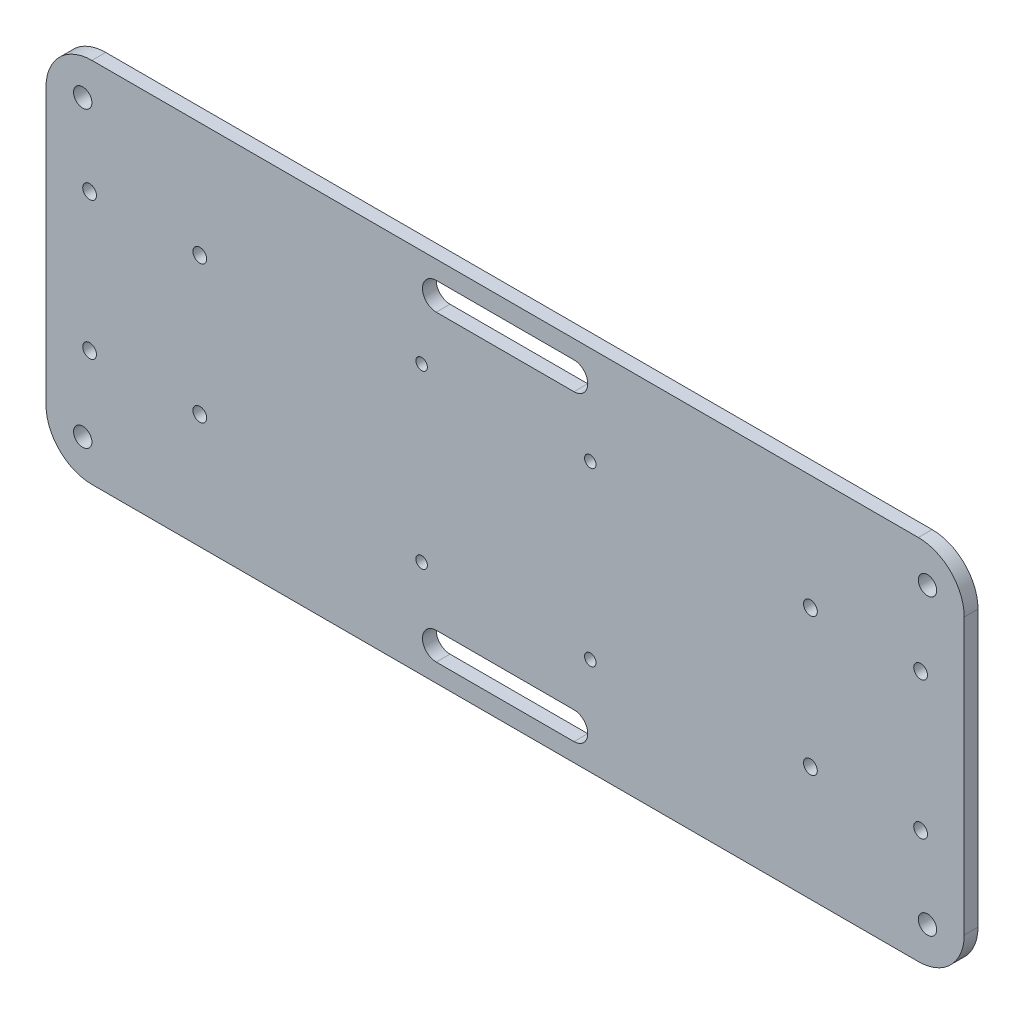
ISO-10303-21;
HEADER;
FILE_DESCRIPTION(('STEP AP214'),'2;1');
FILE_NAME('part.step','',(''),(''),'','','');
FILE_SCHEMA(('AUTOMOTIVE_DESIGN { 1 0 10303 214 1 1 1 1 }'));
ENDSEC;
DATA;
#1=APPLICATION_CONTEXT('core data for automotive mechanical design processes');
#2=APPLICATION_PROTOCOL_DEFINITION('international standard','automotive_design',2000,#1);
#3=PRODUCT_CONTEXT('',#1,'mechanical');
#4=PRODUCT('Part','Part','',(#3));
#5=PRODUCT_RELATED_PRODUCT_CATEGORY('part','',(#4));
#6=PRODUCT_DEFINITION_FORMATION('','',#4);
#7=PRODUCT_DEFINITION_CONTEXT('part definition',#1,'design');
#8=PRODUCT_DEFINITION('design','',#6,#7);
#9=PRODUCT_DEFINITION_SHAPE('','',#8);
#10=(LENGTH_UNIT() NAMED_UNIT(*) SI_UNIT(.MILLI.,.METRE.));
#11=(NAMED_UNIT(*) PLANE_ANGLE_UNIT() SI_UNIT($,.RADIAN.));
#12=(NAMED_UNIT(*) SI_UNIT($,.STERADIAN.) SOLID_ANGLE_UNIT());
#13=UNCERTAINTY_MEASURE_WITH_UNIT(LENGTH_MEASURE(1.E-05),#10,'distance_accuracy_value','');
#14=(GEOMETRIC_REPRESENTATION_CONTEXT(3) GLOBAL_UNCERTAINTY_ASSIGNED_CONTEXT((#13)) GLOBAL_UNIT_ASSIGNED_CONTEXT((#10,
#11,#12)) REPRESENTATION_CONTEXT('',''));
#15=CARTESIAN_POINT('',(0.,0.,0.));
#16=DIRECTION('',(0.,0.,1.));
#17=DIRECTION('',(1.,0.,0.));
#18=AXIS2_PLACEMENT_3D('',#15,#16,#17);
#19=CARTESIAN_POINT('',(100.,40.,3.));
#20=DIRECTION('',(-1.,0.,0.));
#21=DIRECTION('',(0.,0.,1.));
#22=AXIS2_PLACEMENT_3D('',#19,#20,#21);
#23=PLANE('',#22);
#24=DIRECTION('',(0.,1.,0.));
#25=VECTOR('',#24,1.);
#26=CARTESIAN_POINT('',(100.,40.,3.));
#27=LINE('',#26,#25);
#28=CARTESIAN_POINT('',(100.,-30.,3.));
#29=VERTEX_POINT('',#28);
#30=CARTESIAN_POINT('',(100.,30.,3.));
#31=VERTEX_POINT('',#30);
#32=EDGE_CURVE('E246',#29,#31,#27,.T.);
#33=ORIENTED_EDGE('',*,*,#32,.F.);
#34=DIRECTION('',(0.,0.,-1.));
#35=VECTOR('',#34,1.);
#36=CARTESIAN_POINT('',(100.,-30.,3.));
#37=LINE('',#36,#35);
#38=CARTESIAN_POINT('',(100.,-30.,0.));
#39=VERTEX_POINT('',#38);
#40=EDGE_CURVE('E297',#29,#39,#37,.T.);
#41=ORIENTED_EDGE('',*,*,#40,.T.);
#42=DIRECTION('',(0.,1.,0.));
#43=VECTOR('',#42,1.);
#44=CARTESIAN_POINT('',(100.,40.,0.));
#45=LINE('',#44,#43);
#46=CARTESIAN_POINT('',(100.,30.,0.));
#47=VERTEX_POINT('',#46);
#48=EDGE_CURVE('E243',#39,#47,#45,.T.);
#49=ORIENTED_EDGE('',*,*,#48,.T.);
#50=DIRECTION('',(0.,0.,-1.));
#51=VECTOR('',#50,1.);
#52=CARTESIAN_POINT('',(100.,30.,3.));
#53=LINE('',#52,#51);
#54=EDGE_CURVE('E295',#47,#31,#53,.F.);
#55=ORIENTED_EDGE('',*,*,#54,.T.);
#56=EDGE_LOOP('',(#33,#41,#49,#55));
#57=FACE_BOUND('',#56,.T.);
#58=ADVANCED_FACE('F35',(#57),#23,.F.);
#59=CARTESIAN_POINT('',(-100.,40.,3.));
#60=DIRECTION('',(0.,-1.,0.));
#61=DIRECTION('',(0.,0.,-1.));
#62=AXIS2_PLACEMENT_3D('',#59,#60,#61);
#63=PLANE('',#62);
#64=DIRECTION('',(-1.,0.,0.));
#65=VECTOR('',#64,1.);
#66=CARTESIAN_POINT('',(-100.,40.,3.));
#67=LINE('',#66,#65);
#68=CARTESIAN_POINT('',(90.,40.,3.));
#69=VERTEX_POINT('',#68);
#70=CARTESIAN_POINT('',(-90.,40.,3.));
#71=VERTEX_POINT('',#70);
#72=EDGE_CURVE('E249',#69,#71,#67,.T.);
#73=ORIENTED_EDGE('',*,*,#72,.F.);
#74=DIRECTION('',(0.,0.,-1.));
#75=VECTOR('',#74,1.);
#76=CARTESIAN_POINT('',(90.,40.,3.));
#77=LINE('',#76,#75);
#78=CARTESIAN_POINT('',(90.,40.,0.));
#79=VERTEX_POINT('',#78);
#80=EDGE_CURVE('E11',#69,#79,#77,.T.);
#81=ORIENTED_EDGE('',*,*,#80,.T.);
#82=DIRECTION('',(-1.,0.,0.));
#83=VECTOR('',#82,1.);
#84=CARTESIAN_POINT('',(-100.,40.,0.));
#85=LINE('',#84,#83);
#86=CARTESIAN_POINT('',(-90.,40.,0.));
#87=VERTEX_POINT('',#86);
#88=EDGE_CURVE('E262',#79,#87,#85,.T.);
#89=ORIENTED_EDGE('',*,*,#88,.T.);
#90=DIRECTION('',(0.,0.,-1.));
#91=VECTOR('',#90,1.);
#92=CARTESIAN_POINT('',(-90.,40.,3.));
#93=LINE('',#92,#91);
#94=EDGE_CURVE('E43',#87,#71,#93,.F.);
#95=ORIENTED_EDGE('',*,*,#94,.T.);
#96=EDGE_LOOP('',(#73,#81,#89,#95));
#97=FACE_BOUND('',#96,.T.);
#98=ADVANCED_FACE('F302',(#97),#63,.F.);
#99=CARTESIAN_POINT('',(-100.,40.,3.));
#100=DIRECTION('',(1.,0.,0.));
#101=DIRECTION('',(0.,0.,-1.));
#102=AXIS2_PLACEMENT_3D('',#99,#100,#101);
#103=PLANE('',#102);
#104=DIRECTION('',(0.,-1.,0.));
#105=VECTOR('',#104,1.);
#106=CARTESIAN_POINT('',(-100.,40.,0.));
#107=LINE('',#106,#105);
#108=CARTESIAN_POINT('',(-100.,30.,0.));
#109=VERTEX_POINT('',#108);
#110=CARTESIAN_POINT('',(-100.,-30.,0.));
#111=VERTEX_POINT('',#110);
#112=EDGE_CURVE('E265',#109,#111,#107,.T.);
#113=ORIENTED_EDGE('',*,*,#112,.T.);
#114=DIRECTION('',(0.,0.,-1.));
#115=VECTOR('',#114,1.);
#116=CARTESIAN_POINT('',(-100.,-30.,3.));
#117=LINE('',#116,#115);
#118=CARTESIAN_POINT('',(-100.,-30.,3.));
#119=VERTEX_POINT('',#118);
#120=EDGE_CURVE('E285',#111,#119,#117,.F.);
#121=ORIENTED_EDGE('',*,*,#120,.T.);
#122=DIRECTION('',(0.,-1.,0.));
#123=VECTOR('',#122,1.);
#124=CARTESIAN_POINT('',(-100.,40.,3.));
#125=LINE('',#124,#123);
#126=CARTESIAN_POINT('',(-100.,30.,3.));
#127=VERTEX_POINT('',#126);
#128=EDGE_CURVE('E253',#127,#119,#125,.T.);
#129=ORIENTED_EDGE('',*,*,#128,.F.);
#130=DIRECTION('',(0.,0.,-1.));
#131=VECTOR('',#130,1.);
#132=CARTESIAN_POINT('',(-100.,30.,3.));
#133=LINE('',#132,#131);
#134=EDGE_CURVE('E282',#127,#109,#133,.T.);
#135=ORIENTED_EDGE('',*,*,#134,.T.);
#136=EDGE_LOOP('',(#113,#121,#129,#135));
#137=FACE_BOUND('',#136,.T.);
#138=ADVANCED_FACE('F314',(#137),#103,.F.);
#139=CARTESIAN_POINT('',(-100.,-40.,3.));
#140=DIRECTION('',(0.,1.,0.));
#141=DIRECTION('',(0.,0.,1.));
#142=AXIS2_PLACEMENT_3D('',#139,#140,#141);
#143=PLANE('',#142);
#144=DIRECTION('',(1.,0.,0.));
#145=VECTOR('',#144,1.);
#146=CARTESIAN_POINT('',(-100.,-40.,3.));
#147=LINE('',#146,#145);
#148=CARTESIAN_POINT('',(-90.,-40.,3.));
#149=VERTEX_POINT('',#148);
#150=CARTESIAN_POINT('',(90.,-40.,3.));
#151=VERTEX_POINT('',#150);
#152=EDGE_CURVE('E256',#149,#151,#147,.T.);
#153=ORIENTED_EDGE('',*,*,#152,.F.);
#154=DIRECTION('',(0.,0.,-1.));
#155=VECTOR('',#154,1.);
#156=CARTESIAN_POINT('',(-90.,-40.,3.));
#157=LINE('',#156,#155);
#158=CARTESIAN_POINT('',(-90.,-40.,0.));
#159=VERTEX_POINT('',#158);
#160=EDGE_CURVE('E271',#149,#159,#157,.T.);
#161=ORIENTED_EDGE('',*,*,#160,.T.);
#162=DIRECTION('',(1.,0.,0.));
#163=VECTOR('',#162,1.);
#164=CARTESIAN_POINT('',(-100.,-40.,0.));
#165=LINE('',#164,#163);
#166=CARTESIAN_POINT('',(90.,-40.,0.));
#167=VERTEX_POINT('',#166);
#168=EDGE_CURVE('E250',#159,#167,#165,.T.);
#169=ORIENTED_EDGE('',*,*,#168,.T.);
#170=DIRECTION('',(0.,0.,-1.));
#171=VECTOR('',#170,1.);
#172=CARTESIAN_POINT('',(90.,-40.,3.));
#173=LINE('',#172,#171);
#174=EDGE_CURVE('E259',#167,#151,#173,.F.);
#175=ORIENTED_EDGE('',*,*,#174,.T.);
#176=EDGE_LOOP('',(#153,#161,#169,#175));
#177=FACE_BOUND('',#176,.T.);
#178=ADVANCED_FACE('F324',(#177),#143,.F.);
#179=CARTESIAN_POINT('',(0.,0.,3.));
#180=DIRECTION('',(0.,0.,1.));
#181=DIRECTION('',(1.,0.,0.));
#182=AXIS2_PLACEMENT_3D('',#179,#180,#181);
#183=PLANE('',#182);
#184=CARTESIAN_POINT('',(90.5,-15.,3.));
#185=DIRECTION('',(0.,0.,-1.));
#186=DIRECTION('',(-1.,0.,0.));
#187=AXIS2_PLACEMENT_3D('',#184,#185,#186);
#188=CIRCLE('',#187,1.5);
#189=CARTESIAN_POINT('',(89.,-15.,3.));
#190=VERTEX_POINT('',#189);
#191=EDGE_CURVE('E651',#190,#190,#188,.T.);
#192=ORIENTED_EDGE('',*,*,#191,.T.);
#193=EDGE_LOOP('',(#192));
#194=FACE_BOUND('',#193,.T.);
#195=CARTESIAN_POINT('',(-90.5,15.,3.));
#196=DIRECTION('',(0.,0.,-1.));
#197=DIRECTION('',(-1.,0.,0.));
#198=AXIS2_PLACEMENT_3D('',#195,#196,#197);
#199=CIRCLE('',#198,1.5);
#200=CARTESIAN_POINT('',(-92.,15.,3.));
#201=VERTEX_POINT('',#200);
#202=EDGE_CURVE('E677',#201,#201,#199,.T.);
#203=ORIENTED_EDGE('',*,*,#202,.T.);
#204=EDGE_LOOP('',(#203));
#205=FACE_BOUND('',#204,.T.);
#206=CARTESIAN_POINT('',(-66.5,15.,3.));
#207=DIRECTION('',(0.,0.,-1.));
#208=DIRECTION('',(-1.,0.,0.));
#209=AXIS2_PLACEMENT_3D('',#206,#207,#208);
#210=CIRCLE('',#209,1.5);
#211=CARTESIAN_POINT('',(-68.,15.,3.));
#212=VERTEX_POINT('',#211);
#213=EDGE_CURVE('E671',#212,#212,#210,.T.);
#214=ORIENTED_EDGE('',*,*,#213,.T.);
#215=EDGE_LOOP('',(#214));
#216=FACE_BOUND('',#215,.T.);
#217=CARTESIAN_POINT('',(-90.5,-15.,3.));
#218=DIRECTION('',(0.,0.,-1.));
#219=DIRECTION('',(-1.,0.,0.));
#220=AXIS2_PLACEMENT_3D('',#217,#218,#219);
#221=CIRCLE('',#220,1.5);
#222=CARTESIAN_POINT('',(-92.,-15.,3.));
#223=VERTEX_POINT('',#222);
#224=EDGE_CURVE('E664',#223,#223,#221,.T.);
#225=ORIENTED_EDGE('',*,*,#224,.T.);
#226=EDGE_LOOP('',(#225));
#227=FACE_BOUND('',#226,.T.);
#228=CARTESIAN_POINT('',(66.5,-15.,3.));
#229=DIRECTION('',(0.,0.,-1.));
#230=DIRECTION('',(-1.,0.,0.));
#231=AXIS2_PLACEMENT_3D('',#228,#229,#230);
#232=CIRCLE('',#231,1.5);
#233=CARTESIAN_POINT('',(65.,-15.,3.));
#234=VERTEX_POINT('',#233);
#235=EDGE_CURVE('E655',#234,#234,#232,.T.);
#236=ORIENTED_EDGE('',*,*,#235,.T.);
#237=EDGE_LOOP('',(#236));
#238=FACE_BOUND('',#237,.T.);
#239=CARTESIAN_POINT('',(66.5,15.,3.));
#240=DIRECTION('',(0.,0.,-1.));
#241=DIRECTION('',(-1.,0.,0.));
#242=AXIS2_PLACEMENT_3D('',#239,#240,#241);
#243=CIRCLE('',#242,1.5);
#244=CARTESIAN_POINT('',(65.,15.,3.));
#245=VERTEX_POINT('',#244);
#246=EDGE_CURVE('E773',#245,#245,#243,.T.);
#247=ORIENTED_EDGE('',*,*,#246,.T.);
#248=EDGE_LOOP('',(#247));
#249=FACE_BOUND('',#248,.T.);
#250=CARTESIAN_POINT('',(90.5,15.,3.));
#251=DIRECTION('',(0.,0.,-1.));
#252=DIRECTION('',(-1.,0.,0.));
#253=AXIS2_PLACEMENT_3D('',#250,#251,#252);
#254=CIRCLE('',#253,1.50000000000001);
#255=CARTESIAN_POINT('',(89.,15.,3.));
#256=VERTEX_POINT('',#255);
#257=EDGE_CURVE('E767',#256,#256,#254,.T.);
#258=ORIENTED_EDGE('',*,*,#257,.T.);
#259=EDGE_LOOP('',(#258));
#260=FACE_BOUND('',#259,.T.);
#261=CARTESIAN_POINT('',(-66.5,-15.,3.));
#262=DIRECTION('',(0.,0.,-1.));
#263=DIRECTION('',(-1.,0.,0.));
#264=AXIS2_PLACEMENT_3D('',#261,#262,#263);
#265=CIRCLE('',#264,1.5);
#266=CARTESIAN_POINT('',(-68.,-15.,3.));
#267=VERTEX_POINT('',#266);
#268=EDGE_CURVE('E678',#267,#267,#265,.T.);
#269=ORIENTED_EDGE('',*,*,#268,.T.);
#270=EDGE_LOOP('',(#269));
#271=FACE_BOUND('',#270,.T.);
#272=CARTESIAN_POINT('',(18.5560885899999,18.63631327,3.));
#273=DIRECTION('',(0.,0.,1.));
#274=DIRECTION('',(1.,0.,0.));
#275=AXIS2_PLACEMENT_3D('',#272,#273,#274);
#276=CIRCLE('',#275,1.24999999999859);
#277=CARTESIAN_POINT('',(19.8060885899985,18.63631327,3.));
#278=VERTEX_POINT('',#277);
#279=EDGE_CURVE('E681',#278,#278,#276,.T.);
#280=ORIENTED_EDGE('',*,*,#279,.F.);
#281=EDGE_LOOP('',(#280));
#282=FACE_BOUND('',#281,.T.);
#283=CARTESIAN_POINT('',(-18.1857117300001,18.63631327,3.));
#284=DIRECTION('',(0.,0.,1.));
#285=DIRECTION('',(1.,0.,0.));
#286=AXIS2_PLACEMENT_3D('',#283,#284,#285);
#287=CIRCLE('',#286,1.2499999999986);
#288=CARTESIAN_POINT('',(-16.9357117300015,18.63631327,3.));
#289=VERTEX_POINT('',#288);
#290=EDGE_CURVE('E693',#289,#289,#287,.T.);
#291=ORIENTED_EDGE('',*,*,#290,.F.);
#292=EDGE_LOOP('',(#291));
#293=FACE_BOUND('',#292,.T.);
#294=CARTESIAN_POINT('',(-18.1857117300001,-18.74318761,3.));
#295=DIRECTION('',(0.,0.,1.));
#296=DIRECTION('',(1.,0.,0.));
#297=AXIS2_PLACEMENT_3D('',#294,#295,#296);
#298=CIRCLE('',#297,1.24999999999859);
#299=CARTESIAN_POINT('',(-16.9357117300015,-18.74318761,3.));
#300=VERTEX_POINT('',#299);
#301=EDGE_CURVE('E687',#300,#300,#298,.T.);
#302=ORIENTED_EDGE('',*,*,#301,.F.);
#303=EDGE_LOOP('',(#302));
#304=FACE_BOUND('',#303,.T.);
#305=CARTESIAN_POINT('',(18.5560885899999,-18.74318761,3.));
#306=DIRECTION('',(0.,0.,1.));
#307=DIRECTION('',(1.,0.,0.));
#308=AXIS2_PLACEMENT_3D('',#305,#306,#307);
#309=CIRCLE('',#308,1.24999999999859);
#310=CARTESIAN_POINT('',(19.8060885899985,-18.74318761,3.));
#311=VERTEX_POINT('',#310);
#312=EDGE_CURVE('E175',#311,#311,#309,.T.);
#313=ORIENTED_EDGE('',*,*,#312,.F.);
#314=EDGE_LOOP('',(#313));
#315=FACE_BOUND('',#314,.T.);
#316=CARTESIAN_POINT('',(15.,33.,3.));
#317=DIRECTION('',(0.,0.,1.));
#318=DIRECTION('',(1.,0.,0.));
#319=AXIS2_PLACEMENT_3D('',#316,#317,#318);
#320=CIRCLE('',#319,3.);
#321=CARTESIAN_POINT('',(15.,30.,3.));
#322=VERTEX_POINT('',#321);
#323=CARTESIAN_POINT('',(15.,36.,3.));
#324=VERTEX_POINT('',#323);
#325=EDGE_CURVE('E50',#322,#324,#320,.T.);
#326=ORIENTED_EDGE('',*,*,#325,.F.);
#327=DIRECTION('',(1.,0.,0.));
#328=VECTOR('',#327,1.);
#329=CARTESIAN_POINT('',(15.,30.,3.));
#330=LINE('',#329,#328);
#331=CARTESIAN_POINT('',(-15.,30.,3.));
#332=VERTEX_POINT('',#331);
#333=EDGE_CURVE('E169',#332,#322,#330,.T.);
#334=ORIENTED_EDGE('',*,*,#333,.F.);
#335=CARTESIAN_POINT('',(-15.,33.,3.));
#336=DIRECTION('',(0.,0.,1.));
#337=DIRECTION('',(1.,0.,0.));
#338=AXIS2_PLACEMENT_3D('',#335,#336,#337);
#339=CIRCLE('',#338,3.);
#340=CARTESIAN_POINT('',(-15.,36.,3.));
#341=VERTEX_POINT('',#340);
#342=EDGE_CURVE('E172',#341,#332,#339,.T.);
#343=ORIENTED_EDGE('',*,*,#342,.F.);
#344=DIRECTION('',(-1.,0.,0.));
#345=VECTOR('',#344,1.);
#346=CARTESIAN_POINT('',(15.,36.,3.));
#347=LINE('',#346,#345);
#348=EDGE_CURVE('E181',#324,#341,#347,.T.);
#349=ORIENTED_EDGE('',*,*,#348,.F.);
#350=EDGE_LOOP('',(#326,#334,#343,#349));
#351=FACE_BOUND('',#350,.T.);
#352=CARTESIAN_POINT('',(15.,-33.,3.));
#353=DIRECTION('',(0.,0.,1.));
#354=DIRECTION('',(-1.,0.,0.));
#355=AXIS2_PLACEMENT_3D('',#352,#353,#354);
#356=CIRCLE('',#355,3.);
#357=CARTESIAN_POINT('',(15.,-36.,3.));
#358=VERTEX_POINT('',#357);
#359=CARTESIAN_POINT('',(15.,-30.,3.));
#360=VERTEX_POINT('',#359);
#361=EDGE_CURVE('E58',#358,#360,#356,.T.);
#362=ORIENTED_EDGE('',*,*,#361,.F.);
#363=DIRECTION('',(1.,0.,0.));
#364=VECTOR('',#363,1.);
#365=CARTESIAN_POINT('',(15.,-36.,3.));
#366=LINE('',#365,#364);
#367=CARTESIAN_POINT('',(-15.,-36.,3.));
#368=VERTEX_POINT('',#367);
#369=EDGE_CURVE('E196',#368,#358,#366,.T.);
#370=ORIENTED_EDGE('',*,*,#369,.F.);
#371=CARTESIAN_POINT('',(-15.,-33.,3.));
#372=DIRECTION('',(0.,0.,1.));
#373=DIRECTION('',(-1.,0.,0.));
#374=AXIS2_PLACEMENT_3D('',#371,#372,#373);
#375=CIRCLE('',#374,3.);
#376=CARTESIAN_POINT('',(-15.,-30.,3.));
#377=VERTEX_POINT('',#376);
#378=EDGE_CURVE('E211',#377,#368,#375,.T.);
#379=ORIENTED_EDGE('',*,*,#378,.F.);
#380=DIRECTION('',(-1.,0.,0.));
#381=VECTOR('',#380,1.);
#382=CARTESIAN_POINT('',(15.,-30.,3.));
#383=LINE('',#382,#381);
#384=EDGE_CURVE('E207',#360,#377,#383,.T.);
#385=ORIENTED_EDGE('',*,*,#384,.F.);
#386=EDGE_LOOP('',(#362,#370,#379,#385));
#387=FACE_BOUND('',#386,.T.);
#388=CARTESIAN_POINT('',(92.,32.,3.));
#389=DIRECTION('',(0.,0.,1.));
#390=DIRECTION('',(-1.,0.,0.));
#391=AXIS2_PLACEMENT_3D('',#388,#389,#390);
#392=CIRCLE('',#391,2.);
#393=CARTESIAN_POINT('',(90.,32.,3.));
#394=VERTEX_POINT('',#393);
#395=EDGE_CURVE('E188',#394,#394,#392,.T.);
#396=ORIENTED_EDGE('',*,*,#395,.F.);
#397=EDGE_LOOP('',(#396));
#398=FACE_BOUND('',#397,.T.);
#399=CARTESIAN_POINT('',(92.0000000000001,-32.,3.));
#400=DIRECTION('',(0.,0.,1.));
#401=DIRECTION('',(1.,0.,0.));
#402=AXIS2_PLACEMENT_3D('',#399,#400,#401);
#403=CIRCLE('',#402,2.);
#404=CARTESIAN_POINT('',(94.0000000000001,-32.,3.));
#405=VERTEX_POINT('',#404);
#406=EDGE_CURVE('E232',#405,#405,#403,.T.);
#407=ORIENTED_EDGE('',*,*,#406,.F.);
#408=EDGE_LOOP('',(#407));
#409=FACE_BOUND('',#408,.T.);
#410=CARTESIAN_POINT('',(-92.,-32.,3.));
#411=DIRECTION('',(0.,0.,1.));
#412=DIRECTION('',(-1.,0.,0.));
#413=AXIS2_PLACEMENT_3D('',#410,#411,#412);
#414=CIRCLE('',#413,2.);
#415=CARTESIAN_POINT('',(-94.,-32.,3.));
#416=VERTEX_POINT('',#415);
#417=EDGE_CURVE('E226',#416,#416,#414,.T.);
#418=ORIENTED_EDGE('',*,*,#417,.F.);
#419=EDGE_LOOP('',(#418));
#420=FACE_BOUND('',#419,.T.);
#421=CARTESIAN_POINT('',(-92.,32.,3.));
#422=DIRECTION('',(0.,0.,1.));
#423=DIRECTION('',(1.,0.,0.));
#424=AXIS2_PLACEMENT_3D('',#421,#422,#423);
#425=CIRCLE('',#424,2.);
#426=CARTESIAN_POINT('',(-90.,32.,3.));
#427=VERTEX_POINT('',#426);
#428=EDGE_CURVE('E225',#427,#427,#425,.T.);
#429=ORIENTED_EDGE('',*,*,#428,.F.);
#430=EDGE_LOOP('',(#429));
#431=FACE_BOUND('',#430,.T.);
#432=ORIENTED_EDGE('',*,*,#128,.T.);
#433=CARTESIAN_POINT('',(-90.,-30.,3.));
#434=DIRECTION('',(0.,0.,1.));
#435=DIRECTION('',(1.,0.,0.));
#436=AXIS2_PLACEMENT_3D('',#433,#434,#435);
#437=CIRCLE('',#436,10.);
#438=EDGE_CURVE('E293',#119,#149,#437,.T.);
#439=ORIENTED_EDGE('',*,*,#438,.T.);
#440=ORIENTED_EDGE('',*,*,#152,.T.);
#441=CARTESIAN_POINT('',(90.,-30.,3.));
#442=DIRECTION('',(0.,0.,1.));
#443=DIRECTION('',(1.,0.,0.));
#444=AXIS2_PLACEMENT_3D('',#441,#442,#443);
#445=CIRCLE('',#444,10.);
#446=EDGE_CURVE('E291',#151,#29,#445,.T.);
#447=ORIENTED_EDGE('',*,*,#446,.T.);
#448=ORIENTED_EDGE('',*,*,#32,.T.);
#449=CARTESIAN_POINT('',(90.,30.,3.));
#450=DIRECTION('',(0.,0.,1.));
#451=DIRECTION('',(1.,0.,0.));
#452=AXIS2_PLACEMENT_3D('',#449,#450,#451);
#453=CIRCLE('',#452,10.);
#454=EDGE_CURVE('E289',#31,#69,#453,.T.);
#455=ORIENTED_EDGE('',*,*,#454,.T.);
#456=ORIENTED_EDGE('',*,*,#72,.T.);
#457=CARTESIAN_POINT('',(-90.,30.,3.));
#458=DIRECTION('',(0.,0.,1.));
#459=DIRECTION('',(1.,0.,0.));
#460=AXIS2_PLACEMENT_3D('',#457,#458,#459);
#461=CIRCLE('',#460,10.);
#462=EDGE_CURVE('E287',#71,#127,#461,.T.);
#463=ORIENTED_EDGE('',*,*,#462,.T.);
#464=EDGE_LOOP('',(#432,#439,#440,#447,#448,#455,#456,#463));
#465=FACE_BOUND('',#464,.T.);
#466=ADVANCED_FACE('F308',(#194,#205,#216,#227,#238,#249,#260,#271,#282,#293,#304,#315,#351,
#387,#398,#409,#420,#431,#465),#183,.T.);
#467=CARTESIAN_POINT('',(0.,0.,0.));
#468=DIRECTION('',(0.,0.,1.));
#469=DIRECTION('',(1.,0.,0.));
#470=AXIS2_PLACEMENT_3D('',#467,#468,#469);
#471=PLANE('',#470);
#472=CARTESIAN_POINT('',(90.5,-15.,0.));
#473=DIRECTION('',(0.,0.,-1.));
#474=DIRECTION('',(-1.,0.,0.));
#475=AXIS2_PLACEMENT_3D('',#472,#473,#474);
#476=CIRCLE('',#475,1.5);
#477=CARTESIAN_POINT('',(89.,-15.,0.));
#478=VERTEX_POINT('',#477);
#479=EDGE_CURVE('E654',#478,#478,#476,.T.);
#480=ORIENTED_EDGE('',*,*,#479,.F.);
#481=EDGE_LOOP('',(#480));
#482=FACE_BOUND('',#481,.T.);
#483=CARTESIAN_POINT('',(-90.5,15.,0.));
#484=DIRECTION('',(0.,0.,-1.));
#485=DIRECTION('',(-1.,0.,0.));
#486=AXIS2_PLACEMENT_3D('',#483,#484,#485);
#487=CIRCLE('',#486,1.5);
#488=CARTESIAN_POINT('',(-92.,15.,0.));
#489=VERTEX_POINT('',#488);
#490=EDGE_CURVE('E657',#489,#489,#487,.T.);
#491=ORIENTED_EDGE('',*,*,#490,.F.);
#492=EDGE_LOOP('',(#491));
#493=FACE_BOUND('',#492,.T.);
#494=CARTESIAN_POINT('',(-66.5,15.,0.));
#495=DIRECTION('',(0.,0.,-1.));
#496=DIRECTION('',(-1.,0.,0.));
#497=AXIS2_PLACEMENT_3D('',#494,#495,#496);
#498=CIRCLE('',#497,1.5);
#499=CARTESIAN_POINT('',(-68.,15.,0.));
#500=VERTEX_POINT('',#499);
#501=EDGE_CURVE('E674',#500,#500,#498,.T.);
#502=ORIENTED_EDGE('',*,*,#501,.F.);
#503=EDGE_LOOP('',(#502));
#504=FACE_BOUND('',#503,.T.);
#505=CARTESIAN_POINT('',(-90.5,-15.,0.));
#506=DIRECTION('',(0.,0.,-1.));
#507=DIRECTION('',(-1.,0.,0.));
#508=AXIS2_PLACEMENT_3D('',#505,#506,#507);
#509=CIRCLE('',#508,1.5);
#510=CARTESIAN_POINT('',(-92.,-15.,0.));
#511=VERTEX_POINT('',#510);
#512=EDGE_CURVE('E668',#511,#511,#509,.T.);
#513=ORIENTED_EDGE('',*,*,#512,.F.);
#514=EDGE_LOOP('',(#513));
#515=FACE_BOUND('',#514,.T.);
#516=CARTESIAN_POINT('',(66.5,-15.,0.));
#517=DIRECTION('',(0.,0.,-1.));
#518=DIRECTION('',(-1.,0.,0.));
#519=AXIS2_PLACEMENT_3D('',#516,#517,#518);
#520=CIRCLE('',#519,1.5);
#521=CARTESIAN_POINT('',(65.,-15.,0.));
#522=VERTEX_POINT('',#521);
#523=EDGE_CURVE('E660',#522,#522,#520,.T.);
#524=ORIENTED_EDGE('',*,*,#523,.F.);
#525=EDGE_LOOP('',(#524));
#526=FACE_BOUND('',#525,.T.);
#527=CARTESIAN_POINT('',(66.5,15.,0.));
#528=DIRECTION('',(0.,0.,-1.));
#529=DIRECTION('',(-1.,0.,0.));
#530=AXIS2_PLACEMENT_3D('',#527,#528,#529);
#531=CIRCLE('',#530,1.5);
#532=CARTESIAN_POINT('',(65.,15.,0.));
#533=VERTEX_POINT('',#532);
#534=EDGE_CURVE('E770',#533,#533,#531,.T.);
#535=ORIENTED_EDGE('',*,*,#534,.F.);
#536=EDGE_LOOP('',(#535));
#537=FACE_BOUND('',#536,.T.);
#538=CARTESIAN_POINT('',(90.5,15.,0.));
#539=DIRECTION('',(0.,0.,-1.));
#540=DIRECTION('',(-1.,0.,0.));
#541=AXIS2_PLACEMENT_3D('',#538,#539,#540);
#542=CIRCLE('',#541,1.50000000000001);
#543=CARTESIAN_POINT('',(89.,15.,0.));
#544=VERTEX_POINT('',#543);
#545=EDGE_CURVE('E764',#544,#544,#542,.T.);
#546=ORIENTED_EDGE('',*,*,#545,.F.);
#547=EDGE_LOOP('',(#546));
#548=FACE_BOUND('',#547,.T.);
#549=CARTESIAN_POINT('',(-66.5,-15.,0.));
#550=DIRECTION('',(0.,0.,-1.));
#551=DIRECTION('',(-1.,0.,0.));
#552=AXIS2_PLACEMENT_3D('',#549,#550,#551);
#553=CIRCLE('',#552,1.5);
#554=CARTESIAN_POINT('',(-68.,-15.,0.));
#555=VERTEX_POINT('',#554);
#556=EDGE_CURVE('E667',#555,#555,#553,.T.);
#557=ORIENTED_EDGE('',*,*,#556,.F.);
#558=EDGE_LOOP('',(#557));
#559=FACE_BOUND('',#558,.T.);
#560=CARTESIAN_POINT('',(18.5560885899999,18.63631327,0.));
#561=DIRECTION('',(0.,0.,1.));
#562=DIRECTION('',(1.,0.,0.));
#563=AXIS2_PLACEMENT_3D('',#560,#561,#562);
#564=CIRCLE('',#563,1.24999999999859);
#565=CARTESIAN_POINT('',(19.8060885899985,18.63631327,0.));
#566=VERTEX_POINT('',#565);
#567=EDGE_CURVE('E696',#566,#566,#564,.T.);
#568=ORIENTED_EDGE('',*,*,#567,.T.);
#569=EDGE_LOOP('',(#568));
#570=FACE_BOUND('',#569,.T.);
#571=CARTESIAN_POINT('',(-18.1857117300001,18.63631327,0.));
#572=DIRECTION('',(0.,0.,1.));
#573=DIRECTION('',(1.,0.,0.));
#574=AXIS2_PLACEMENT_3D('',#571,#572,#573);
#575=CIRCLE('',#574,1.2499999999986);
#576=CARTESIAN_POINT('',(-16.9357117300015,18.63631327,0.));
#577=VERTEX_POINT('',#576);
#578=EDGE_CURVE('E690',#577,#577,#575,.T.);
#579=ORIENTED_EDGE('',*,*,#578,.T.);
#580=EDGE_LOOP('',(#579));
#581=FACE_BOUND('',#580,.T.);
#582=CARTESIAN_POINT('',(-18.1857117300001,-18.74318761,0.));
#583=DIRECTION('',(0.,0.,1.));
#584=DIRECTION('',(1.,0.,0.));
#585=AXIS2_PLACEMENT_3D('',#582,#583,#584);
#586=CIRCLE('',#585,1.24999999999859);
#587=CARTESIAN_POINT('',(-16.9357117300015,-18.74318761,0.));
#588=VERTEX_POINT('',#587);
#589=EDGE_CURVE('E684',#588,#588,#586,.T.);
#590=ORIENTED_EDGE('',*,*,#589,.T.);
#591=EDGE_LOOP('',(#590));
#592=FACE_BOUND('',#591,.T.);
#593=CARTESIAN_POINT('',(18.5560885899999,-18.74318761,0.));
#594=DIRECTION('',(0.,0.,1.));
#595=DIRECTION('',(1.,0.,0.));
#596=AXIS2_PLACEMENT_3D('',#593,#594,#595);
#597=CIRCLE('',#596,1.24999999999859);
#598=CARTESIAN_POINT('',(19.8060885899985,-18.74318761,0.));
#599=VERTEX_POINT('',#598);
#600=EDGE_CURVE('E208',#599,#599,#597,.T.);
#601=ORIENTED_EDGE('',*,*,#600,.T.);
#602=EDGE_LOOP('',(#601));
#603=FACE_BOUND('',#602,.T.);
#604=DIRECTION('',(1.,0.,0.));
#605=VECTOR('',#604,1.);
#606=CARTESIAN_POINT('',(15.,30.,0.));
#607=LINE('',#606,#605);
#608=CARTESIAN_POINT('',(-15.,30.,0.));
#609=VERTEX_POINT('',#608);
#610=CARTESIAN_POINT('',(15.,30.,0.));
#611=VERTEX_POINT('',#610);
#612=EDGE_CURVE('E156',#609,#611,#607,.T.);
#613=ORIENTED_EDGE('',*,*,#612,.T.);
#614=CARTESIAN_POINT('',(15.,33.,0.));
#615=DIRECTION('',(0.,0.,1.));
#616=DIRECTION('',(1.,0.,0.));
#617=AXIS2_PLACEMENT_3D('',#614,#615,#616);
#618=CIRCLE('',#617,3.);
#619=CARTESIAN_POINT('',(15.,36.,0.));
#620=VERTEX_POINT('',#619);
#621=EDGE_CURVE('E150',#611,#620,#618,.T.);
#622=ORIENTED_EDGE('',*,*,#621,.T.);
#623=DIRECTION('',(-1.,0.,0.));
#624=VECTOR('',#623,1.);
#625=CARTESIAN_POINT('',(15.,36.,0.));
#626=LINE('',#625,#624);
#627=CARTESIAN_POINT('',(-15.,36.,0.));
#628=VERTEX_POINT('',#627);
#629=EDGE_CURVE('E160',#620,#628,#626,.T.);
#630=ORIENTED_EDGE('',*,*,#629,.T.);
#631=CARTESIAN_POINT('',(-15.,33.,0.));
#632=DIRECTION('',(0.,0.,1.));
#633=DIRECTION('',(1.,0.,0.));
#634=AXIS2_PLACEMENT_3D('',#631,#632,#633);
#635=CIRCLE('',#634,3.);
#636=EDGE_CURVE('E164',#628,#609,#635,.T.);
#637=ORIENTED_EDGE('',*,*,#636,.T.);
#638=EDGE_LOOP('',(#613,#622,#630,#637));
#639=FACE_BOUND('',#638,.T.);
#640=DIRECTION('',(1.,0.,0.));
#641=VECTOR('',#640,1.);
#642=CARTESIAN_POINT('',(15.,-36.,0.));
#643=LINE('',#642,#641);
#644=CARTESIAN_POINT('',(-15.,-36.,0.));
#645=VERTEX_POINT('',#644);
#646=CARTESIAN_POINT('',(15.,-36.,0.));
#647=VERTEX_POINT('',#646);
#648=EDGE_CURVE('E202',#645,#647,#643,.T.);
#649=ORIENTED_EDGE('',*,*,#648,.T.);
#650=CARTESIAN_POINT('',(15.,-33.,0.));
#651=DIRECTION('',(0.,0.,1.));
#652=DIRECTION('',(-1.,0.,0.));
#653=AXIS2_PLACEMENT_3D('',#650,#651,#652);
#654=CIRCLE('',#653,3.);
#655=CARTESIAN_POINT('',(15.,-30.,0.));
#656=VERTEX_POINT('',#655);
#657=EDGE_CURVE('E192',#647,#656,#654,.T.);
#658=ORIENTED_EDGE('',*,*,#657,.T.);
#659=DIRECTION('',(-1.,0.,0.));
#660=VECTOR('',#659,1.);
#661=CARTESIAN_POINT('',(15.,-30.,0.));
#662=LINE('',#661,#660);
#663=CARTESIAN_POINT('',(-15.,-30.,0.));
#664=VERTEX_POINT('',#663);
#665=EDGE_CURVE('E195',#656,#664,#662,.T.);
#666=ORIENTED_EDGE('',*,*,#665,.T.);
#667=CARTESIAN_POINT('',(-15.,-33.,0.));
#668=DIRECTION('',(0.,0.,1.));
#669=DIRECTION('',(-1.,0.,0.));
#670=AXIS2_PLACEMENT_3D('',#667,#668,#669);
#671=CIRCLE('',#670,3.);
#672=EDGE_CURVE('E199',#664,#645,#671,.T.);
#673=ORIENTED_EDGE('',*,*,#672,.T.);
#674=EDGE_LOOP('',(#649,#658,#666,#673));
#675=FACE_BOUND('',#674,.T.);
#676=CARTESIAN_POINT('',(92.,32.,0.));
#677=DIRECTION('',(0.,0.,1.));
#678=DIRECTION('',(-1.,0.,0.));
#679=AXIS2_PLACEMENT_3D('',#676,#677,#678);
#680=CIRCLE('',#679,2.);
#681=CARTESIAN_POINT('',(90.,32.,0.));
#682=VERTEX_POINT('',#681);
#683=EDGE_CURVE('E235',#682,#682,#680,.T.);
#684=ORIENTED_EDGE('',*,*,#683,.T.);
#685=EDGE_LOOP('',(#684));
#686=FACE_BOUND('',#685,.T.);
#687=CARTESIAN_POINT('',(92.0000000000001,-32.,0.));
#688=DIRECTION('',(0.,0.,1.));
#689=DIRECTION('',(1.,0.,0.));
#690=AXIS2_PLACEMENT_3D('',#687,#688,#689);
#691=CIRCLE('',#690,2.);
#692=CARTESIAN_POINT('',(94.0000000000001,-32.,0.));
#693=VERTEX_POINT('',#692);
#694=EDGE_CURVE('E229',#693,#693,#691,.T.);
#695=ORIENTED_EDGE('',*,*,#694,.T.);
#696=EDGE_LOOP('',(#695));
#697=FACE_BOUND('',#696,.T.);
#698=CARTESIAN_POINT('',(-92.,-32.,0.));
#699=DIRECTION('',(0.,0.,1.));
#700=DIRECTION('',(-1.,0.,0.));
#701=AXIS2_PLACEMENT_3D('',#698,#699,#700);
#702=CIRCLE('',#701,2.);
#703=CARTESIAN_POINT('',(-94.,-32.,0.));
#704=VERTEX_POINT('',#703);
#705=EDGE_CURVE('E222',#704,#704,#702,.T.);
#706=ORIENTED_EDGE('',*,*,#705,.T.);
#707=EDGE_LOOP('',(#706));
#708=FACE_BOUND('',#707,.T.);
#709=CARTESIAN_POINT('',(-92.,32.,0.));
#710=DIRECTION('',(0.,0.,1.));
#711=DIRECTION('',(1.,0.,0.));
#712=AXIS2_PLACEMENT_3D('',#709,#710,#711);
#713=CIRCLE('',#712,2.);
#714=CARTESIAN_POINT('',(-90.,32.,0.));
#715=VERTEX_POINT('',#714);
#716=EDGE_CURVE('E240',#715,#715,#713,.T.);
#717=ORIENTED_EDGE('',*,*,#716,.T.);
#718=EDGE_LOOP('',(#717));
#719=FACE_BOUND('',#718,.T.);
#720=ORIENTED_EDGE('',*,*,#168,.F.);
#721=CARTESIAN_POINT('',(-90.,-30.,0.));
#722=DIRECTION('',(0.,0.,1.));
#723=DIRECTION('',(1.,0.,0.));
#724=AXIS2_PLACEMENT_3D('',#721,#722,#723);
#725=CIRCLE('',#724,10.);
#726=EDGE_CURVE('E280',#159,#111,#725,.F.);
#727=ORIENTED_EDGE('',*,*,#726,.T.);
#728=ORIENTED_EDGE('',*,*,#112,.F.);
#729=CARTESIAN_POINT('',(-90.,30.,0.));
#730=DIRECTION('',(0.,0.,1.));
#731=DIRECTION('',(1.,0.,0.));
#732=AXIS2_PLACEMENT_3D('',#729,#730,#731);
#733=CIRCLE('',#732,10.);
#734=EDGE_CURVE('E274',#109,#87,#733,.F.);
#735=ORIENTED_EDGE('',*,*,#734,.T.);
#736=ORIENTED_EDGE('',*,*,#88,.F.);
#737=CARTESIAN_POINT('',(90.,30.,0.));
#738=DIRECTION('',(0.,0.,1.));
#739=DIRECTION('',(1.,0.,0.));
#740=AXIS2_PLACEMENT_3D('',#737,#738,#739);
#741=CIRCLE('',#740,10.);
#742=EDGE_CURVE('E276',#79,#47,#741,.F.);
#743=ORIENTED_EDGE('',*,*,#742,.T.);
#744=ORIENTED_EDGE('',*,*,#48,.F.);
#745=CARTESIAN_POINT('',(90.,-30.,0.));
#746=DIRECTION('',(0.,0.,1.));
#747=DIRECTION('',(1.,0.,0.));
#748=AXIS2_PLACEMENT_3D('',#745,#746,#747);
#749=CIRCLE('',#748,10.);
#750=EDGE_CURVE('E278',#39,#167,#749,.F.);
#751=ORIENTED_EDGE('',*,*,#750,.T.);
#752=EDGE_LOOP('',(#720,#727,#728,#735,#736,#743,#744,#751));
#753=FACE_BOUND('',#752,.T.);
#754=ADVANCED_FACE('F166',(#482,#493,#504,#515,#526,#537,#548,#559,#570,#581,#592,#603,#639,
#675,#686,#697,#708,#719,#753),#471,.F.);
#755=CARTESIAN_POINT('',(-92.,32.,0.));
#756=DIRECTION('',(0.,0.,1.));
#757=DIRECTION('',(1.,0.,0.));
#758=AXIS2_PLACEMENT_3D('',#755,#756,#757);
#759=CYLINDRICAL_SURFACE('',#758,2.);
#760=ORIENTED_EDGE('',*,*,#716,.F.);
#761=EDGE_LOOP('',(#760));
#762=FACE_BOUND('',#761,.T.);
#763=ORIENTED_EDGE('',*,*,#428,.T.);
#764=EDGE_LOOP('',(#763));
#765=FACE_BOUND('',#764,.T.);
#766=ADVANCED_FACE('F369',(#762,#765),#759,.F.);
#767=CARTESIAN_POINT('',(-92.,-32.,0.));
#768=DIRECTION('',(0.,0.,1.));
#769=DIRECTION('',(1.,0.,0.));
#770=AXIS2_PLACEMENT_3D('',#767,#768,#769);
#771=CYLINDRICAL_SURFACE('',#770,2.);
#772=ORIENTED_EDGE('',*,*,#705,.F.);
#773=EDGE_LOOP('',(#772));
#774=FACE_BOUND('',#773,.T.);
#775=ORIENTED_EDGE('',*,*,#417,.T.);
#776=EDGE_LOOP('',(#775));
#777=FACE_BOUND('',#776,.T.);
#778=ADVANCED_FACE('F362',(#774,#777),#771,.F.);
#779=CARTESIAN_POINT('',(92.0000000000001,-32.,0.));
#780=DIRECTION('',(0.,0.,1.));
#781=DIRECTION('',(1.,0.,0.));
#782=AXIS2_PLACEMENT_3D('',#779,#780,#781);
#783=CYLINDRICAL_SURFACE('',#782,2.);
#784=ORIENTED_EDGE('',*,*,#694,.F.);
#785=EDGE_LOOP('',(#784));
#786=FACE_BOUND('',#785,.T.);
#787=ORIENTED_EDGE('',*,*,#406,.T.);
#788=EDGE_LOOP('',(#787));
#789=FACE_BOUND('',#788,.T.);
#790=ADVANCED_FACE('F356',(#786,#789),#783,.F.);
#791=CARTESIAN_POINT('',(92.,32.,0.));
#792=DIRECTION('',(0.,0.,1.));
#793=DIRECTION('',(1.,0.,0.));
#794=AXIS2_PLACEMENT_3D('',#791,#792,#793);
#795=CYLINDRICAL_SURFACE('',#794,2.);
#796=ORIENTED_EDGE('',*,*,#683,.F.);
#797=EDGE_LOOP('',(#796));
#798=FACE_BOUND('',#797,.T.);
#799=ORIENTED_EDGE('',*,*,#395,.T.);
#800=EDGE_LOOP('',(#799));
#801=FACE_BOUND('',#800,.T.);
#802=ADVANCED_FACE('F352',(#798,#801),#795,.F.);
#803=CARTESIAN_POINT('',(-90.,-30.,3.));
#804=DIRECTION('',(0.,0.,-1.));
#805=DIRECTION('',(-1.,0.,0.));
#806=AXIS2_PLACEMENT_3D('',#803,#804,#805);
#807=CYLINDRICAL_SURFACE('',#806,10.);
#808=ORIENTED_EDGE('',*,*,#438,.F.);
#809=ORIENTED_EDGE('',*,*,#120,.F.);
#810=ORIENTED_EDGE('',*,*,#726,.F.);
#811=ORIENTED_EDGE('',*,*,#160,.F.);
#812=EDGE_LOOP('',(#808,#809,#810,#811));
#813=FACE_BOUND('',#812,.T.);
#814=ADVANCED_FACE('F321',(#813),#807,.T.);
#815=CARTESIAN_POINT('',(90.,-30.,3.));
#816=DIRECTION('',(0.,0.,-1.));
#817=DIRECTION('',(-1.,0.,0.));
#818=AXIS2_PLACEMENT_3D('',#815,#816,#817);
#819=CYLINDRICAL_SURFACE('',#818,10.);
#820=ORIENTED_EDGE('',*,*,#446,.F.);
#821=ORIENTED_EDGE('',*,*,#174,.F.);
#822=ORIENTED_EDGE('',*,*,#750,.F.);
#823=ORIENTED_EDGE('',*,*,#40,.F.);
#824=EDGE_LOOP('',(#820,#821,#822,#823));
#825=FACE_BOUND('',#824,.T.);
#826=ADVANCED_FACE('F330',(#825),#819,.T.);
#827=CARTESIAN_POINT('',(90.,30.,3.));
#828=DIRECTION('',(0.,0.,-1.));
#829=DIRECTION('',(-1.,0.,0.));
#830=AXIS2_PLACEMENT_3D('',#827,#828,#829);
#831=CYLINDRICAL_SURFACE('',#830,10.);
#832=ORIENTED_EDGE('',*,*,#454,.F.);
#833=ORIENTED_EDGE('',*,*,#54,.F.);
#834=ORIENTED_EDGE('',*,*,#742,.F.);
#835=ORIENTED_EDGE('',*,*,#80,.F.);
#836=EDGE_LOOP('',(#832,#833,#834,#835));
#837=FACE_BOUND('',#836,.T.);
#838=ADVANCED_FACE('F335',(#837),#831,.T.);
#839=CARTESIAN_POINT('',(-90.,30.,3.));
#840=DIRECTION('',(0.,0.,-1.));
#841=DIRECTION('',(-1.,0.,0.));
#842=AXIS2_PLACEMENT_3D('',#839,#840,#841);
#843=CYLINDRICAL_SURFACE('',#842,10.);
#844=ORIENTED_EDGE('',*,*,#462,.F.);
#845=ORIENTED_EDGE('',*,*,#94,.F.);
#846=ORIENTED_EDGE('',*,*,#734,.F.);
#847=ORIENTED_EDGE('',*,*,#134,.F.);
#848=EDGE_LOOP('',(#844,#845,#846,#847));
#849=FACE_BOUND('',#848,.T.);
#850=ADVANCED_FACE('F37',(#849),#843,.T.);
#851=CARTESIAN_POINT('',(15.,-33.,0.));
#852=DIRECTION('',(0.,0.,1.));
#853=DIRECTION('',(1.,0.,0.));
#854=AXIS2_PLACEMENT_3D('',#851,#852,#853);
#855=CYLINDRICAL_SURFACE('',#854,3.);
#856=ORIENTED_EDGE('',*,*,#361,.T.);
#857=DIRECTION('',(0.,0.,1.));
#858=VECTOR('',#857,1.);
#859=CARTESIAN_POINT('',(15.,-30.,0.));
#860=LINE('',#859,#858);
#861=EDGE_CURVE('E205',#656,#360,#860,.T.);
#862=ORIENTED_EDGE('',*,*,#861,.F.);
#863=ORIENTED_EDGE('',*,*,#657,.F.);
#864=DIRECTION('',(0.,0.,1.));
#865=VECTOR('',#864,1.);
#866=CARTESIAN_POINT('',(15.,-36.,0.));
#867=LINE('',#866,#865);
#868=EDGE_CURVE('E182',#647,#358,#867,.T.);
#869=ORIENTED_EDGE('',*,*,#868,.T.);
#870=EDGE_LOOP('',(#856,#862,#863,#869));
#871=FACE_BOUND('',#870,.T.);
#872=ADVANCED_FACE('F341',(#871),#855,.F.);
#873=CARTESIAN_POINT('',(15.,-36.,0.));
#874=DIRECTION('',(0.,-1.,0.));
#875=DIRECTION('',(0.,0.,-1.));
#876=AXIS2_PLACEMENT_3D('',#873,#874,#875);
#877=PLANE('',#876);
#878=ORIENTED_EDGE('',*,*,#369,.T.);
#879=ORIENTED_EDGE('',*,*,#868,.F.);
#880=ORIENTED_EDGE('',*,*,#648,.F.);
#881=DIRECTION('',(0.,0.,1.));
#882=VECTOR('',#881,1.);
#883=CARTESIAN_POINT('',(-15.,-36.,0.));
#884=LINE('',#883,#882);
#885=EDGE_CURVE('E217',#645,#368,#884,.T.);
#886=ORIENTED_EDGE('',*,*,#885,.T.);
#887=EDGE_LOOP('',(#878,#879,#880,#886));
#888=FACE_BOUND('',#887,.T.);
#889=ADVANCED_FACE('F461',(#888),#877,.F.);
#890=CARTESIAN_POINT('',(-15.,-33.,0.));
#891=DIRECTION('',(0.,0.,1.));
#892=DIRECTION('',(1.,0.,0.));
#893=AXIS2_PLACEMENT_3D('',#890,#891,#892);
#894=CYLINDRICAL_SURFACE('',#893,3.);
#895=ORIENTED_EDGE('',*,*,#378,.T.);
#896=ORIENTED_EDGE('',*,*,#885,.F.);
#897=ORIENTED_EDGE('',*,*,#672,.F.);
#898=DIRECTION('',(0.,0.,1.));
#899=VECTOR('',#898,1.);
#900=CARTESIAN_POINT('',(-15.,-30.,0.));
#901=LINE('',#900,#899);
#902=EDGE_CURVE('E219',#664,#377,#901,.T.);
#903=ORIENTED_EDGE('',*,*,#902,.T.);
#904=EDGE_LOOP('',(#895,#896,#897,#903));
#905=FACE_BOUND('',#904,.T.);
#906=ADVANCED_FACE('F469',(#905),#894,.F.);
#907=CARTESIAN_POINT('',(15.,-30.,0.));
#908=DIRECTION('',(0.,1.,0.));
#909=DIRECTION('',(0.,0.,1.));
#910=AXIS2_PLACEMENT_3D('',#907,#908,#909);
#911=PLANE('',#910);
#912=ORIENTED_EDGE('',*,*,#384,.T.);
#913=ORIENTED_EDGE('',*,*,#902,.F.);
#914=ORIENTED_EDGE('',*,*,#665,.F.);
#915=ORIENTED_EDGE('',*,*,#861,.T.);
#916=EDGE_LOOP('',(#912,#913,#914,#915));
#917=FACE_BOUND('',#916,.T.);
#918=ADVANCED_FACE('F478',(#917),#911,.F.);
#919=CARTESIAN_POINT('',(15.,33.,0.));
#920=DIRECTION('',(0.,0.,1.));
#921=DIRECTION('',(1.,0.,0.));
#922=AXIS2_PLACEMENT_3D('',#919,#920,#921);
#923=CYLINDRICAL_SURFACE('',#922,3.);
#924=ORIENTED_EDGE('',*,*,#325,.T.);
#925=DIRECTION('',(0.,0.,1.));
#926=VECTOR('',#925,1.);
#927=CARTESIAN_POINT('',(15.,36.,0.));
#928=LINE('',#927,#926);
#929=EDGE_CURVE('E146',#620,#324,#928,.T.);
#930=ORIENTED_EDGE('',*,*,#929,.F.);
#931=ORIENTED_EDGE('',*,*,#621,.F.);
#932=DIRECTION('',(0.,0.,1.));
#933=VECTOR('',#932,1.);
#934=CARTESIAN_POINT('',(15.,30.,0.));
#935=LINE('',#934,#933);
#936=EDGE_CURVE('E186',#611,#322,#935,.T.);
#937=ORIENTED_EDGE('',*,*,#936,.T.);
#938=EDGE_LOOP('',(#924,#930,#931,#937));
#939=FACE_BOUND('',#938,.T.);
#940=ADVANCED_FACE('F148',(#939),#923,.F.);
#941=CARTESIAN_POINT('',(15.,30.,0.));
#942=DIRECTION('',(0.,-1.,0.));
#943=DIRECTION('',(0.,0.,-1.));
#944=AXIS2_PLACEMENT_3D('',#941,#942,#943);
#945=PLANE('',#944);
#946=ORIENTED_EDGE('',*,*,#333,.T.);
#947=ORIENTED_EDGE('',*,*,#936,.F.);
#948=ORIENTED_EDGE('',*,*,#612,.F.);
#949=DIRECTION('',(0.,0.,1.));
#950=VECTOR('',#949,1.);
#951=CARTESIAN_POINT('',(-15.,30.,0.));
#952=LINE('',#951,#950);
#953=EDGE_CURVE('E189',#609,#332,#952,.T.);
#954=ORIENTED_EDGE('',*,*,#953,.T.);
#955=EDGE_LOOP('',(#946,#947,#948,#954));
#956=FACE_BOUND('',#955,.T.);
#957=ADVANCED_FACE('F495',(#956),#945,.F.);
#958=CARTESIAN_POINT('',(-15.,33.,0.));
#959=DIRECTION('',(0.,0.,1.));
#960=DIRECTION('',(1.,0.,0.));
#961=AXIS2_PLACEMENT_3D('',#958,#959,#960);
#962=CYLINDRICAL_SURFACE('',#961,3.);
#963=ORIENTED_EDGE('',*,*,#342,.T.);
#964=ORIENTED_EDGE('',*,*,#953,.F.);
#965=ORIENTED_EDGE('',*,*,#636,.F.);
#966=DIRECTION('',(0.,0.,1.));
#967=VECTOR('',#966,1.);
#968=CARTESIAN_POINT('',(-15.,36.,0.));
#969=LINE('',#968,#967);
#970=EDGE_CURVE('E155',#628,#341,#969,.T.);
#971=ORIENTED_EDGE('',*,*,#970,.T.);
#972=EDGE_LOOP('',(#963,#964,#965,#971));
#973=FACE_BOUND('',#972,.T.);
#974=ADVANCED_FACE('F503',(#973),#962,.F.);
#975=CARTESIAN_POINT('',(15.,36.,0.));
#976=DIRECTION('',(0.,1.,0.));
#977=DIRECTION('',(0.,0.,1.));
#978=AXIS2_PLACEMENT_3D('',#975,#976,#977);
#979=PLANE('',#978);
#980=ORIENTED_EDGE('',*,*,#348,.T.);
#981=ORIENTED_EDGE('',*,*,#970,.F.);
#982=ORIENTED_EDGE('',*,*,#629,.F.);
#983=ORIENTED_EDGE('',*,*,#929,.T.);
#984=EDGE_LOOP('',(#980,#981,#982,#983));
#985=FACE_BOUND('',#984,.T.);
#986=ADVANCED_FACE('F161',(#985),#979,.F.);
#987=CARTESIAN_POINT('',(18.5560885899999,-18.74318761,0.));
#988=DIRECTION('',(0.,0.,1.));
#989=DIRECTION('',(1.,0.,0.));
#990=AXIS2_PLACEMENT_3D('',#987,#988,#989);
#991=CYLINDRICAL_SURFACE('',#990,1.24999999999859);
#992=ORIENTED_EDGE('',*,*,#600,.F.);
#993=EDGE_LOOP('',(#992));
#994=FACE_BOUND('',#993,.T.);
#995=ORIENTED_EDGE('',*,*,#312,.T.);
#996=EDGE_LOOP('',(#995));
#997=FACE_BOUND('',#996,.T.);
#998=ADVANCED_FACE('F520',(#994,#997),#991,.F.);
#999=CARTESIAN_POINT('',(-18.1857117300001,-18.74318761,0.));
#1000=DIRECTION('',(0.,0.,1.));
#1001=DIRECTION('',(1.,0.,0.));
#1002=AXIS2_PLACEMENT_3D('',#999,#1000,#1001);
#1003=CYLINDRICAL_SURFACE('',#1002,1.24999999999859);
#1004=ORIENTED_EDGE('',*,*,#589,.F.);
#1005=EDGE_LOOP('',(#1004));
#1006=FACE_BOUND('',#1005,.T.);
#1007=ORIENTED_EDGE('',*,*,#301,.T.);
#1008=EDGE_LOOP('',(#1007));
#1009=FACE_BOUND('',#1008,.T.);
#1010=ADVANCED_FACE('F528',(#1006,#1009),#1003,.F.);
#1011=CARTESIAN_POINT('',(-18.1857117300001,18.63631327,0.));
#1012=DIRECTION('',(0.,0.,1.));
#1013=DIRECTION('',(1.,0.,0.));
#1014=AXIS2_PLACEMENT_3D('',#1011,#1012,#1013);
#1015=CYLINDRICAL_SURFACE('',#1014,1.2499999999986);
#1016=ORIENTED_EDGE('',*,*,#578,.F.);
#1017=EDGE_LOOP('',(#1016));
#1018=FACE_BOUND('',#1017,.T.);
#1019=ORIENTED_EDGE('',*,*,#290,.T.);
#1020=EDGE_LOOP('',(#1019));
#1021=FACE_BOUND('',#1020,.T.);
#1022=ADVANCED_FACE('F537',(#1018,#1021),#1015,.F.);
#1023=CARTESIAN_POINT('',(18.5560885899999,18.63631327,0.));
#1024=DIRECTION('',(0.,0.,1.));
#1025=DIRECTION('',(1.,0.,0.));
#1026=AXIS2_PLACEMENT_3D('',#1023,#1024,#1025);
#1027=CYLINDRICAL_SURFACE('',#1026,1.24999999999859);
#1028=ORIENTED_EDGE('',*,*,#567,.F.);
#1029=EDGE_LOOP('',(#1028));
#1030=FACE_BOUND('',#1029,.T.);
#1031=ORIENTED_EDGE('',*,*,#279,.T.);
#1032=EDGE_LOOP('',(#1031));
#1033=FACE_BOUND('',#1032,.T.);
#1034=ADVANCED_FACE('F546',(#1030,#1033),#1027,.F.);
#1035=CARTESIAN_POINT('',(-66.5,-15.,3.));
#1036=DIRECTION('',(0.,0.,-1.));
#1037=DIRECTION('',(-1.,0.,0.));
#1038=AXIS2_PLACEMENT_3D('',#1035,#1036,#1037);
#1039=CYLINDRICAL_SURFACE('',#1038,1.5);
#1040=ORIENTED_EDGE('',*,*,#268,.F.);
#1041=EDGE_LOOP('',(#1040));
#1042=FACE_BOUND('',#1041,.T.);
#1043=ORIENTED_EDGE('',*,*,#556,.T.);
#1044=EDGE_LOOP('',(#1043));
#1045=FACE_BOUND('',#1044,.T.);
#1046=ADVANCED_FACE('F554',(#1042,#1045),#1039,.F.);
#1047=CARTESIAN_POINT('',(90.5,15.,3.));
#1048=DIRECTION('',(0.,0.,-1.));
#1049=DIRECTION('',(-1.,0.,0.));
#1050=AXIS2_PLACEMENT_3D('',#1047,#1048,#1049);
#1051=CYLINDRICAL_SURFACE('',#1050,1.50000000000001);
#1052=ORIENTED_EDGE('',*,*,#257,.F.);
#1053=EDGE_LOOP('',(#1052));
#1054=FACE_BOUND('',#1053,.T.);
#1055=ORIENTED_EDGE('',*,*,#545,.T.);
#1056=EDGE_LOOP('',(#1055));
#1057=FACE_BOUND('',#1056,.T.);
#1058=ADVANCED_FACE('F562',(#1054,#1057),#1051,.F.);
#1059=CARTESIAN_POINT('',(66.5,15.,3.));
#1060=DIRECTION('',(0.,0.,-1.));
#1061=DIRECTION('',(-1.,0.,0.));
#1062=AXIS2_PLACEMENT_3D('',#1059,#1060,#1061);
#1063=CYLINDRICAL_SURFACE('',#1062,1.5);
#1064=ORIENTED_EDGE('',*,*,#246,.F.);
#1065=EDGE_LOOP('',(#1064));
#1066=FACE_BOUND('',#1065,.T.);
#1067=ORIENTED_EDGE('',*,*,#534,.T.);
#1068=EDGE_LOOP('',(#1067));
#1069=FACE_BOUND('',#1068,.T.);
#1070=ADVANCED_FACE('F571',(#1066,#1069),#1063,.F.);
#1071=CARTESIAN_POINT('',(66.5,-15.,3.));
#1072=DIRECTION('',(0.,0.,-1.));
#1073=DIRECTION('',(-1.,0.,0.));
#1074=AXIS2_PLACEMENT_3D('',#1071,#1072,#1073);
#1075=CYLINDRICAL_SURFACE('',#1074,1.5);
#1076=ORIENTED_EDGE('',*,*,#235,.F.);
#1077=EDGE_LOOP('',(#1076));
#1078=FACE_BOUND('',#1077,.T.);
#1079=ORIENTED_EDGE('',*,*,#523,.T.);
#1080=EDGE_LOOP('',(#1079));
#1081=FACE_BOUND('',#1080,.T.);
#1082=ADVANCED_FACE('F580',(#1078,#1081),#1075,.F.);
#1083=CARTESIAN_POINT('',(-90.5,-15.,3.));
#1084=DIRECTION('',(0.,0.,-1.));
#1085=DIRECTION('',(-1.,0.,0.));
#1086=AXIS2_PLACEMENT_3D('',#1083,#1084,#1085);
#1087=CYLINDRICAL_SURFACE('',#1086,1.5);
#1088=ORIENTED_EDGE('',*,*,#224,.F.);
#1089=EDGE_LOOP('',(#1088));
#1090=FACE_BOUND('',#1089,.T.);
#1091=ORIENTED_EDGE('',*,*,#512,.T.);
#1092=EDGE_LOOP('',(#1091));
#1093=FACE_BOUND('',#1092,.T.);
#1094=ADVANCED_FACE('F589',(#1090,#1093),#1087,.F.);
#1095=CARTESIAN_POINT('',(-66.5,15.,3.));
#1096=DIRECTION('',(0.,0.,-1.));
#1097=DIRECTION('',(-1.,0.,0.));
#1098=AXIS2_PLACEMENT_3D('',#1095,#1096,#1097);
#1099=CYLINDRICAL_SURFACE('',#1098,1.5);
#1100=ORIENTED_EDGE('',*,*,#213,.F.);
#1101=EDGE_LOOP('',(#1100));
#1102=FACE_BOUND('',#1101,.T.);
#1103=ORIENTED_EDGE('',*,*,#501,.T.);
#1104=EDGE_LOOP('',(#1103));
#1105=FACE_BOUND('',#1104,.T.);
#1106=ADVANCED_FACE('F598',(#1102,#1105),#1099,.F.);
#1107=CARTESIAN_POINT('',(-90.5,15.,3.));
#1108=DIRECTION('',(0.,0.,-1.));
#1109=DIRECTION('',(-1.,0.,0.));
#1110=AXIS2_PLACEMENT_3D('',#1107,#1108,#1109);
#1111=CYLINDRICAL_SURFACE('',#1110,1.5);
#1112=ORIENTED_EDGE('',*,*,#202,.F.);
#1113=EDGE_LOOP('',(#1112));
#1114=FACE_BOUND('',#1113,.T.);
#1115=ORIENTED_EDGE('',*,*,#490,.T.);
#1116=EDGE_LOOP('',(#1115));
#1117=FACE_BOUND('',#1116,.T.);
#1118=ADVANCED_FACE('F607',(#1114,#1117),#1111,.F.);
#1119=CARTESIAN_POINT('',(90.5,-15.,3.));
#1120=DIRECTION('',(0.,0.,-1.));
#1121=DIRECTION('',(-1.,0.,0.));
#1122=AXIS2_PLACEMENT_3D('',#1119,#1120,#1121);
#1123=CYLINDRICAL_SURFACE('',#1122,1.5);
#1124=ORIENTED_EDGE('',*,*,#191,.F.);
#1125=EDGE_LOOP('',(#1124));
#1126=FACE_BOUND('',#1125,.T.);
#1127=ORIENTED_EDGE('',*,*,#479,.T.);
#1128=EDGE_LOOP('',(#1127));
#1129=FACE_BOUND('',#1128,.T.);
#1130=ADVANCED_FACE('F616',(#1126,#1129),#1123,.F.);
#1131=CLOSED_SHELL('',(#58,#98,#138,#178,#466,#754,#766,#778,#790,#802,#814,#826,#838,#850,#872,
#889,#906,#918,#940,#957,#974,#986,#998,#1010,#1022,#1034,#1046,#1058,#1070,#1082,#1094,#1106,
#1118,#1130));
#1132=MANIFOLD_SOLID_BREP('B2',#1131);
#1133=ADVANCED_BREP_SHAPE_REPRESENTATION('',(#18,#1132),#14);
#1134=SHAPE_DEFINITION_REPRESENTATION(#9,#1133);
ENDSEC;
END-ISO-10303-21;
